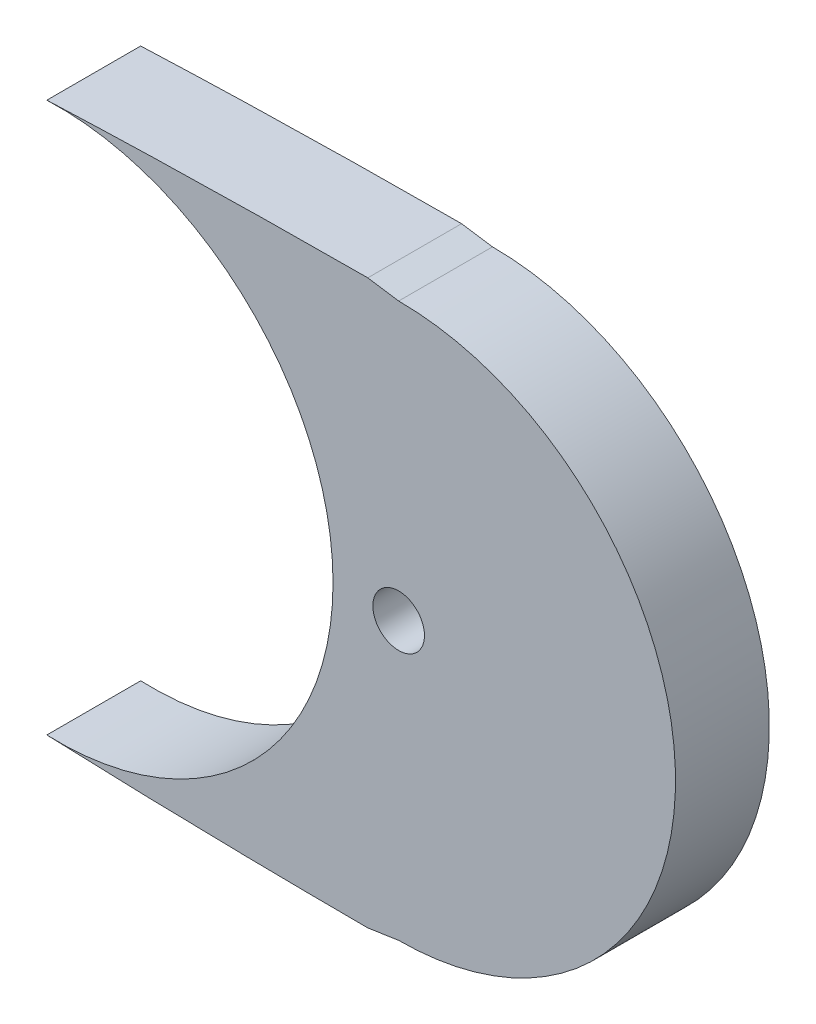
ISO-10303-21;
HEADER;
FILE_DESCRIPTION(('STEP AP214'),'2;1');
FILE_NAME('part.step','',(''),(''),'','','');
FILE_SCHEMA(('AUTOMOTIVE_DESIGN { 1 0 10303 214 1 1 1 1 }'));
ENDSEC;
DATA;
#1=APPLICATION_CONTEXT('core data for automotive mechanical design processes');
#2=APPLICATION_PROTOCOL_DEFINITION('international standard','automotive_design',2000,#1);
#3=PRODUCT_CONTEXT('',#1,'mechanical');
#4=PRODUCT('Part','Part','',(#3));
#5=PRODUCT_RELATED_PRODUCT_CATEGORY('part','',(#4));
#6=PRODUCT_DEFINITION_FORMATION('','',#4);
#7=PRODUCT_DEFINITION_CONTEXT('part definition',#1,'design');
#8=PRODUCT_DEFINITION('design','',#6,#7);
#9=PRODUCT_DEFINITION_SHAPE('','',#8);
#10=(LENGTH_UNIT() NAMED_UNIT(*) SI_UNIT(.MILLI.,.METRE.));
#11=(NAMED_UNIT(*) PLANE_ANGLE_UNIT() SI_UNIT($,.RADIAN.));
#12=(NAMED_UNIT(*) SI_UNIT($,.STERADIAN.) SOLID_ANGLE_UNIT());
#13=UNCERTAINTY_MEASURE_WITH_UNIT(LENGTH_MEASURE(1.E-05),#10,'distance_accuracy_value','');
#14=(GEOMETRIC_REPRESENTATION_CONTEXT(3) GLOBAL_UNCERTAINTY_ASSIGNED_CONTEXT((#13)) GLOBAL_UNIT_ASSIGNED_CONTEXT((#10,
#11,#12)) REPRESENTATION_CONTEXT('',''));
#15=CARTESIAN_POINT('',(0.,0.,0.));
#16=DIRECTION('',(0.,0.,1.));
#17=DIRECTION('',(1.,0.,0.));
#18=AXIS2_PLACEMENT_3D('',#15,#16,#17);
#19=CARTESIAN_POINT('',(300.,0.378,6.));
#20=CARTESIAN_POINT('',(299.845901447221,0.39961034336831,6.));
#21=CARTESIAN_POINT('',(299.230346714046,0.48593399083917,6.));
#22=CARTESIAN_POINT('',(297.848901683276,0.678531057447331,6.));
#23=CARTESIAN_POINT('',(295.556029122455,0.996787499241564,6.));
#24=CARTESIAN_POINT('',(292.365739581197,1.43343203295321,6.));
#25=CARTESIAN_POINT('',(288.297856433401,1.98344889126347,6.));
#26=CARTESIAN_POINT('',(283.377248038078,2.63572648359042,6.));
#27=CARTESIAN_POINT('',(277.63430498472,3.38149178862329,6.));
#28=CARTESIAN_POINT('',(271.104515413466,4.20901604095742,6.));
#29=CARTESIAN_POINT('',(263.828064626846,5.10718872872647,6.));
#30=CARTESIAN_POINT('',(255.849823781818,6.06276893212352,6.));
#31=CARTESIAN_POINT('',(247.21903434379,7.06424307195608,6.));
#32=CARTESIAN_POINT('',(237.988783489903,8.09787318806774,6.));
#33=CARTESIAN_POINT('',(228.216029511608,9.15107036010328,6.));
#34=CARTESIAN_POINT('',(217.961088379031,10.2107446574668,6.));
#35=CARTESIAN_POINT('',(207.287161839572,11.2632209265187,6.));
#36=CARTESIAN_POINT('',(196.260086850424,12.2937248064858,6.));
#37=CARTESIAN_POINT('',(184.947773044503,13.2887281219597,6.));
#38=CARTESIAN_POINT('',(173.420088229148,14.2315961384787,6.));
#39=CARTESIAN_POINT('',(161.747864995533,15.1069553720124,6.));
#40=CARTESIAN_POINT('',(150.00317252135,15.8985540753976,6.));
#41=CARTESIAN_POINT('',(138.258374542497,16.5898406039741,6.));
#42=CARTESIAN_POINT('',(126.585774705795,17.1633504747405,6.));
#43=CARTESIAN_POINT('',(115.057462615139,17.6037905135667,6.));
#44=CARTESIAN_POINT('',(103.744181572864,17.8967919128621,6.));
#45=CARTESIAN_POINT('',(92.7158453472272,18.0280433746414,6.));
#46=CARTESIAN_POINT('',(82.0402185013839,17.9871287273908,6.));
#47=CARTESIAN_POINT('',(71.7831190583338,17.7661449762132,6.));
#48=CARTESIAN_POINT('',(62.0076841473254,17.3594904245971,6.));
#49=CARTESIAN_POINT('',(52.7740834437817,16.7661013276277,6.));
#50=CARTESIAN_POINT('',(44.1390669938569,15.987763153894,6.));
#51=CARTESIAN_POINT('',(36.1554749512941,15.0305547578774,6.));
#52=CARTESIAN_POINT('',(28.8719698679608,13.9026205663682,6.));
#53=CARTESIAN_POINT('',(22.3326880228315,12.6157408879695,6.));
#54=CARTESIAN_POINT('',(16.5759570466198,11.1844668147641,6.));
#55=CARTESIAN_POINT('',(11.6344891822112,9.62275505380201,6.));
#56=CARTESIAN_POINT('',(7.53339032845527,7.94515078115887,6.));
#57=CARTESIAN_POINT('',(4.28573900369485,6.16300377839948,6.));
#58=CARTESIAN_POINT('',(1.8965325692393,4.27279663699588,6.));
#59=CARTESIAN_POINT('',(0.366265286449645,2.2288009510305,6.));
#60=CARTESIAN_POINT('',(-0.170692645797294,0.,6.));
#61=CARTESIAN_POINT('',(0.366265286449666,-2.22880095103055,6.));
#62=CARTESIAN_POINT('',(1.89653256923925,-4.27279663699582,6.));
#63=CARTESIAN_POINT('',(4.28573900369493,-6.16300377839955,6.));
#64=CARTESIAN_POINT('',(7.53339032845521,-7.94515078115883,6.));
#65=CARTESIAN_POINT('',(11.6344891822112,-9.62275505380201,6.));
#66=CARTESIAN_POINT('',(16.5759570466199,-11.1844668147641,6.));
#67=CARTESIAN_POINT('',(22.3326880228314,-12.6157408879695,6.));
#68=CARTESIAN_POINT('',(28.8719698679608,-13.9026205663682,6.));
#69=CARTESIAN_POINT('',(36.155474951294,-15.0305547578773,6.));
#70=CARTESIAN_POINT('',(44.1390669938569,-15.987763153894,6.));
#71=CARTESIAN_POINT('',(52.7740834437817,-16.7661013276277,6.));
#72=CARTESIAN_POINT('',(62.0076841473254,-17.3594904245971,6.));
#73=CARTESIAN_POINT('',(71.7831190583338,-17.7661449762132,6.));
#74=CARTESIAN_POINT('',(82.0402185013839,-17.9871287273908,6.));
#75=CARTESIAN_POINT('',(92.7158453472273,-18.0280433746414,6.));
#76=CARTESIAN_POINT('',(103.744181572864,-17.8967919128621,6.));
#77=CARTESIAN_POINT('',(115.057462615139,-17.6037905135667,6.));
#78=CARTESIAN_POINT('',(126.585774705795,-17.1633504747405,6.));
#79=CARTESIAN_POINT('',(138.258374542497,-16.5898406039741,6.));
#80=CARTESIAN_POINT('',(150.00317252135,-15.8985540753976,6.));
#81=CARTESIAN_POINT('',(161.747864995533,-15.1069553720124,6.));
#82=CARTESIAN_POINT('',(173.420088229148,-14.2315961384787,6.));
#83=CARTESIAN_POINT('',(184.947773044503,-13.2887281219597,6.));
#84=CARTESIAN_POINT('',(196.260086850424,-12.2937248064858,6.));
#85=CARTESIAN_POINT('',(207.287161839572,-11.2632209265187,6.));
#86=CARTESIAN_POINT('',(217.961088379031,-10.2107446574668,6.));
#87=CARTESIAN_POINT('',(228.216029511608,-9.15107036010328,6.));
#88=CARTESIAN_POINT('',(237.988783489903,-8.09787318806774,6.));
#89=CARTESIAN_POINT('',(247.21903434379,-7.06424307195608,6.));
#90=CARTESIAN_POINT('',(255.849823781818,-6.0627689321235,6.));
#91=CARTESIAN_POINT('',(263.828064626846,-5.10718872872648,6.));
#92=CARTESIAN_POINT('',(271.104515413466,-4.20901604095741,6.));
#93=CARTESIAN_POINT('',(277.63430498472,-3.38149178862329,6.));
#94=CARTESIAN_POINT('',(283.377248038078,-2.63572648359043,6.));
#95=CARTESIAN_POINT('',(288.297856433401,-1.98344889126346,6.));
#96=CARTESIAN_POINT('',(292.365739581198,-1.43343203295321,6.));
#97=CARTESIAN_POINT('',(295.556029122455,-0.996787499241567,6.));
#98=CARTESIAN_POINT('',(297.848901683276,-0.678531057447318,6.));
#99=CARTESIAN_POINT('',(299.230346714046,-0.48593399083919,6.));
#100=CARTESIAN_POINT('',(299.845901447221,-0.399610343368311,6.));
#101=CARTESIAN_POINT('',(300.,-0.378,6.));
#102=B_SPLINE_CURVE_WITH_KNOTS('',3,(#19,#20,#21,#22,#23,#24,#25,#26,#27,#28,#29,#30,#31,#32,
#33,#34,#35,#36,#37,#38,#39,#40,#41,#42,#43,#44,#45,#46,#47,#48,#49,#50,#51,#52,#53,#54,#55,#56,
#57,#58,#59,#60,#61,#62,#63,#64,#65,#66,#67,#68,#69,#70,#71,#72,#73,#74,#75,#76,#77,#78,#79,#80,
#81,#82,#83,#84,#85,#86,#87,#88,#89,#90,#91,#92,#93,#94,#95,#96,#97,#98,#99,#100,#101),
.UNSPECIFIED.,.F.,.F.,(4,1,1,1,1,1,1,1,1,1,1,1,1,1,1,1,1,1,1,1,1,1,1,1,1,1,1,1,1,1,1,1,1,1,1,1,
1,1,1,1,1,1,1,1,1,1,1,1,1,1,1,1,1,1,1,1,1,1,1,1,1,1,1,1,1,1,1,1,1,1,1,1,1,1,1,1,1,1,1,1,4),(0.,
0.000763156679271448,0.00304846929193477,0.00684068957953669,0.0121161317605396,
0.0188407924276644,0.0269727495182071,0.0364598537113803,0.0472429445210447,0.0592535547279477,
0.0724172643119224,0.0866510217067198,0.101866322474926,0.117968955401192,0.134857918638583,
0.152428309483259,0.170571841082248,0.189174521814913,0.208122338288737,0.227296649324545,
0.246580070424687,0.265853108019993,0.284996761496293,0.303895241632262,0.322432580929281,
0.340498658943124,0.357984483489282,0.37478811429809,0.390812303248415,0.405965006366899,
0.420162443159487,0.433328264782086,0.445393603392471,0.456301171479378,0.466003880875037,
0.474472000637231,0.481696232103684,0.487703697963338,0.492583405321472,0.496543603187854,0.5,
0.503456396812145,0.507416594678528,0.512296302036662,0.518303767896316,0.525527999362769,
0.533996119124963,0.543698828520622,0.554606396607529,0.566671735217914,0.579837556840513,
0.594034993633101,0.609187696751585,0.62521188570191,0.642015516510718,0.659501341056876,
0.677567419070719,0.696104758367738,0.715003238503707,0.734146891980006,0.753419929575313,
0.772703350675454,0.791877661711263,0.810825478185087,0.829428158917752,0.847571690516741,
0.865142081361417,0.882031044598807,0.898133677525074,0.91334897829328,0.927582735688077,
0.940746445272052,0.952757055478955,0.96354014628862,0.973027250481793,0.981159207572336,
0.98788386823946,0.993159310420463,0.996951530708065,0.999236843320729,1.),.UNSPECIFIED.);
#103=DIRECTION('',(0.,0.,-1.));
#104=VECTOR('',#103,1.);
#105=SURFACE_OF_LINEAR_EXTRUSION('',#102,#104);
#106=DIRECTION('',(0.,0.,1.));
#107=VECTOR('',#106,1.);
#108=CARTESIAN_POINT('',(88.0259213820013,18.002375730703,0.));
#109=LINE('',#108,#107);
#110=CARTESIAN_POINT('',(88.0259213820013,18.002375730703,0.));
#111=VERTEX_POINT('',#110);
#112=CARTESIAN_POINT('',(88.0259213820013,18.002375730703,6.));
#113=VERTEX_POINT('',#112);
#114=EDGE_CURVE('E82',#111,#113,#109,.T.);
#115=ORIENTED_EDGE('',*,*,#114,.F.);
#116=CARTESIAN_POINT('',(300.,0.378,0.));
#117=CARTESIAN_POINT('',(299.845901447221,0.39961034336831,0.));
#118=CARTESIAN_POINT('',(299.230346714046,0.48593399083917,0.));
#119=CARTESIAN_POINT('',(297.848901683276,0.678531057447331,0.));
#120=CARTESIAN_POINT('',(295.556029122455,0.996787499241564,0.));
#121=CARTESIAN_POINT('',(292.365739581197,1.43343203295321,0.));
#122=CARTESIAN_POINT('',(288.297856433401,1.98344889126347,0.));
#123=CARTESIAN_POINT('',(283.377248038078,2.63572648359042,0.));
#124=CARTESIAN_POINT('',(277.63430498472,3.38149178862329,0.));
#125=CARTESIAN_POINT('',(271.104515413466,4.20901604095742,0.));
#126=CARTESIAN_POINT('',(263.828064626846,5.10718872872647,0.));
#127=CARTESIAN_POINT('',(255.849823781818,6.06276893212352,0.));
#128=CARTESIAN_POINT('',(247.21903434379,7.06424307195608,0.));
#129=CARTESIAN_POINT('',(237.988783489903,8.09787318806774,0.));
#130=CARTESIAN_POINT('',(228.216029511608,9.15107036010328,0.));
#131=CARTESIAN_POINT('',(217.961088379031,10.2107446574668,0.));
#132=CARTESIAN_POINT('',(207.287161839572,11.2632209265187,0.));
#133=CARTESIAN_POINT('',(196.260086850424,12.2937248064858,0.));
#134=CARTESIAN_POINT('',(184.947773044503,13.2887281219597,0.));
#135=CARTESIAN_POINT('',(173.420088229148,14.2315961384787,0.));
#136=CARTESIAN_POINT('',(161.747864995533,15.1069553720124,0.));
#137=CARTESIAN_POINT('',(150.00317252135,15.8985540753976,0.));
#138=CARTESIAN_POINT('',(138.258374542497,16.5898406039741,0.));
#139=CARTESIAN_POINT('',(126.585774705795,17.1633504747405,0.));
#140=CARTESIAN_POINT('',(115.057462615139,17.6037905135667,0.));
#141=CARTESIAN_POINT('',(103.744181572864,17.8967919128621,0.));
#142=CARTESIAN_POINT('',(92.7158453472272,18.0280433746414,0.));
#143=CARTESIAN_POINT('',(82.0402185013839,17.9871287273908,0.));
#144=CARTESIAN_POINT('',(71.7831190583338,17.7661449762132,0.));
#145=CARTESIAN_POINT('',(62.0076841473254,17.3594904245971,0.));
#146=CARTESIAN_POINT('',(52.7740834437817,16.7661013276277,0.));
#147=CARTESIAN_POINT('',(44.1390669938569,15.987763153894,0.));
#148=CARTESIAN_POINT('',(36.1554749512941,15.0305547578774,0.));
#149=CARTESIAN_POINT('',(28.8719698679608,13.9026205663682,0.));
#150=CARTESIAN_POINT('',(22.3326880228315,12.6157408879695,0.));
#151=CARTESIAN_POINT('',(16.5759570466198,11.1844668147641,0.));
#152=CARTESIAN_POINT('',(11.6344891822112,9.62275505380201,0.));
#153=CARTESIAN_POINT('',(7.53339032845527,7.94515078115887,0.));
#154=CARTESIAN_POINT('',(4.28573900369485,6.16300377839948,0.));
#155=CARTESIAN_POINT('',(1.8965325692393,4.27279663699588,0.));
#156=CARTESIAN_POINT('',(0.366265286449645,2.2288009510305,0.));
#157=CARTESIAN_POINT('',(-0.170692645797294,0.,0.));
#158=CARTESIAN_POINT('',(0.366265286449666,-2.22880095103055,0.));
#159=CARTESIAN_POINT('',(1.89653256923925,-4.27279663699582,0.));
#160=CARTESIAN_POINT('',(4.28573900369493,-6.16300377839955,0.));
#161=CARTESIAN_POINT('',(7.53339032845521,-7.94515078115883,0.));
#162=CARTESIAN_POINT('',(11.6344891822112,-9.62275505380201,0.));
#163=CARTESIAN_POINT('',(16.5759570466199,-11.1844668147641,0.));
#164=CARTESIAN_POINT('',(22.3326880228314,-12.6157408879695,0.));
#165=CARTESIAN_POINT('',(28.8719698679608,-13.9026205663682,0.));
#166=CARTESIAN_POINT('',(36.155474951294,-15.0305547578773,0.));
#167=CARTESIAN_POINT('',(44.1390669938569,-15.987763153894,0.));
#168=CARTESIAN_POINT('',(52.7740834437817,-16.7661013276277,0.));
#169=CARTESIAN_POINT('',(62.0076841473254,-17.3594904245971,0.));
#170=CARTESIAN_POINT('',(71.7831190583338,-17.7661449762132,0.));
#171=CARTESIAN_POINT('',(82.0402185013839,-17.9871287273908,0.));
#172=CARTESIAN_POINT('',(92.7158453472273,-18.0280433746414,0.));
#173=CARTESIAN_POINT('',(103.744181572864,-17.8967919128621,0.));
#174=CARTESIAN_POINT('',(115.057462615139,-17.6037905135667,0.));
#175=CARTESIAN_POINT('',(126.585774705795,-17.1633504747405,0.));
#176=CARTESIAN_POINT('',(138.258374542497,-16.5898406039741,0.));
#177=CARTESIAN_POINT('',(150.00317252135,-15.8985540753976,0.));
#178=CARTESIAN_POINT('',(161.747864995533,-15.1069553720124,0.));
#179=CARTESIAN_POINT('',(173.420088229148,-14.2315961384787,0.));
#180=CARTESIAN_POINT('',(184.947773044503,-13.2887281219597,0.));
#181=CARTESIAN_POINT('',(196.260086850424,-12.2937248064858,0.));
#182=CARTESIAN_POINT('',(207.287161839572,-11.2632209265187,0.));
#183=CARTESIAN_POINT('',(217.961088379031,-10.2107446574668,0.));
#184=CARTESIAN_POINT('',(228.216029511608,-9.15107036010328,0.));
#185=CARTESIAN_POINT('',(237.988783489903,-8.09787318806774,0.));
#186=CARTESIAN_POINT('',(247.21903434379,-7.06424307195608,0.));
#187=CARTESIAN_POINT('',(255.849823781818,-6.0627689321235,0.));
#188=CARTESIAN_POINT('',(263.828064626846,-5.10718872872648,0.));
#189=CARTESIAN_POINT('',(271.104515413466,-4.20901604095741,0.));
#190=CARTESIAN_POINT('',(277.63430498472,-3.38149178862329,0.));
#191=CARTESIAN_POINT('',(283.377248038078,-2.63572648359043,0.));
#192=CARTESIAN_POINT('',(288.297856433401,-1.98344889126346,0.));
#193=CARTESIAN_POINT('',(292.365739581198,-1.43343203295321,0.));
#194=CARTESIAN_POINT('',(295.556029122455,-0.996787499241567,0.));
#195=CARTESIAN_POINT('',(297.848901683276,-0.678531057447318,0.));
#196=CARTESIAN_POINT('',(299.230346714046,-0.48593399083919,0.));
#197=CARTESIAN_POINT('',(299.845901447221,-0.399610343368311,0.));
#198=CARTESIAN_POINT('',(300.,-0.378,0.));
#199=B_SPLINE_CURVE_WITH_KNOTS('',3,(#116,#117,#118,#119,#120,#121,#122,#123,#124,#125,#126,
#127,#128,#129,#130,#131,#132,#133,#134,#135,#136,#137,#138,#139,#140,#141,#142,#143,#144,#145,
#146,#147,#148,#149,#150,#151,#152,#153,#154,#155,#156,#157,#158,#159,#160,#161,#162,#163,#164,
#165,#166,#167,#168,#169,#170,#171,#172,#173,#174,#175,#176,#177,#178,#179,#180,#181,#182,#183,
#184,#185,#186,#187,#188,#189,#190,#191,#192,#193,#194,#195,#196,#197,#198),.UNSPECIFIED.,.F.,
.F.,(4,1,1,1,1,1,1,1,1,1,1,1,1,1,1,1,1,1,1,1,1,1,1,1,1,1,1,1,1,1,1,1,1,1,1,1,1,1,1,1,1,1,1,1,1,
1,1,1,1,1,1,1,1,1,1,1,1,1,1,1,1,1,1,1,1,1,1,1,1,1,1,1,1,1,1,1,1,1,1,1,4),(0.,
0.000763156679271448,0.00304846929193477,0.00684068957953669,0.0121161317605396,
0.0188407924276644,0.0269727495182071,0.0364598537113803,0.0472429445210447,0.0592535547279477,
0.0724172643119224,0.0866510217067198,0.101866322474926,0.117968955401192,0.134857918638583,
0.152428309483259,0.170571841082248,0.189174521814913,0.208122338288737,0.227296649324545,
0.246580070424687,0.265853108019993,0.284996761496293,0.303895241632262,0.322432580929281,
0.340498658943124,0.357984483489282,0.37478811429809,0.390812303248415,0.405965006366899,
0.420162443159487,0.433328264782086,0.445393603392471,0.456301171479378,0.466003880875037,
0.474472000637231,0.481696232103684,0.487703697963338,0.492583405321472,0.496543603187854,0.5,
0.503456396812145,0.507416594678528,0.512296302036662,0.518303767896316,0.525527999362769,
0.533996119124963,0.543698828520622,0.554606396607529,0.566671735217914,0.579837556840513,
0.594034993633101,0.609187696751585,0.62521188570191,0.642015516510718,0.659501341056876,
0.677567419070719,0.696104758367738,0.715003238503707,0.734146891980006,0.753419929575313,
0.772703350675454,0.791877661711263,0.810825478185087,0.829428158917752,0.847571690516741,
0.865142081361417,0.882031044598807,0.898133677525074,0.91334897829328,0.927582735688077,
0.940746445272052,0.952757055478955,0.96354014628862,0.973027250481793,0.981159207572336,
0.98788386823946,0.993159310420463,0.996951530708065,0.999236843320729,1.),.UNSPECIFIED.);
#200=CARTESIAN_POINT('',(67.5,17.5789284761189,0.));
#201=VERTEX_POINT('',#200);
#202=EDGE_CURVE('E77',#111,#201,#199,.T.);
#203=ORIENTED_EDGE('',*,*,#202,.T.);
#204=DIRECTION('',(0.,0.,-1.));
#205=VECTOR('',#204,1.);
#206=CARTESIAN_POINT('',(67.5,17.5789284761189,6.));
#207=LINE('',#206,#205);
#208=CARTESIAN_POINT('',(67.5,17.5789284761189,6.));
#209=VERTEX_POINT('',#208);
#210=EDGE_CURVE('E47',#209,#201,#207,.T.);
#211=ORIENTED_EDGE('',*,*,#210,.F.);
#212=EDGE_CURVE('E63',#113,#209,#102,.T.);
#213=ORIENTED_EDGE('',*,*,#212,.F.);
#214=EDGE_LOOP('',(#115,#203,#211,#213));
#215=FACE_BOUND('',#214,.T.);
#216=ADVANCED_FACE('F39',(#215),#105,.F.);
#217=CARTESIAN_POINT('',(0.,0.,6.));
#218=DIRECTION('',(0.,0.,1.));
#219=DIRECTION('',(1.,0.,0.));
#220=AXIS2_PLACEMENT_3D('',#217,#218,#219);
#221=PLANE('',#220);
#222=CARTESIAN_POINT('',(89.9999999999997,0.,6.));
#223=DIRECTION('',(0.,0.,1.));
#224=DIRECTION('',(1.,0.,0.));
#225=AXIS2_PLACEMENT_3D('',#222,#223,#224);
#226=CIRCLE('',#225,1.65);
#227=CARTESIAN_POINT('',(91.6499999999997,0.,6.));
#228=VERTEX_POINT('',#227);
#229=EDGE_CURVE('E94',#228,#228,#226,.T.);
#230=ORIENTED_EDGE('',*,*,#229,.F.);
#231=EDGE_LOOP('',(#230));
#232=FACE_BOUND('',#231,.T.);
#233=CARTESIAN_POINT('',(89.9999999999997,0.,6.));
#234=DIRECTION('',(0.,0.,1.));
#235=DIRECTION('',(1.,0.,0.));
#236=AXIS2_PLACEMENT_3D('',#233,#234,#235);
#237=CIRCLE('',#236,17.7051977534897);
#238=CARTESIAN_POINT('',(89.9999999999996,-17.7051977534897,6.));
#239=VERTEX_POINT('',#238);
#240=CARTESIAN_POINT('',(89.9999999999998,17.7051977534897,6.));
#241=VERTEX_POINT('',#240);
#242=EDGE_CURVE('E177',#239,#241,#237,.T.);
#243=ORIENTED_EDGE('',*,*,#242,.T.);
#244=DIRECTION('',(-0.988857866602842,0.148862754433993,0.));
#245=VECTOR('',#244,1.);
#246=CARTESIAN_POINT('',(4.60068857190731,30.5612179716694,6.));
#247=LINE('',#246,#245);
#248=EDGE_CURVE('E165',#241,#113,#247,.T.);
#249=ORIENTED_EDGE('',*,*,#248,.T.);
#250=ORIENTED_EDGE('',*,*,#212,.T.);
#251=CARTESIAN_POINT('',(68.2098517870718,0.,6.));
#252=DIRECTION('',(0.,0.,1.));
#253=DIRECTION('',(1.,0.,0.));
#254=AXIS2_PLACEMENT_3D('',#251,#252,#253);
#255=CIRCLE('',#254,17.5932548417885);
#256=CARTESIAN_POINT('',(67.5,-17.5789284761189,6.));
#257=VERTEX_POINT('',#256);
#258=EDGE_CURVE('E93',#209,#257,#255,.F.);
#259=ORIENTED_EDGE('',*,*,#258,.T.);
#260=CARTESIAN_POINT('',(300.,0.378,6.));
#261=CARTESIAN_POINT('',(299.845901447221,0.39961034336831,6.));
#262=CARTESIAN_POINT('',(299.230346714046,0.48593399083917,6.));
#263=CARTESIAN_POINT('',(297.848901683276,0.678531057447331,6.));
#264=CARTESIAN_POINT('',(295.556029122455,0.996787499241564,6.));
#265=CARTESIAN_POINT('',(292.365739581197,1.43343203295321,6.));
#266=CARTESIAN_POINT('',(288.297856433401,1.98344889126347,6.));
#267=CARTESIAN_POINT('',(283.377248038078,2.63572648359042,6.));
#268=CARTESIAN_POINT('',(277.63430498472,3.38149178862329,6.));
#269=CARTESIAN_POINT('',(271.104515413466,4.20901604095742,6.));
#270=CARTESIAN_POINT('',(263.828064626846,5.10718872872647,6.));
#271=CARTESIAN_POINT('',(255.849823781818,6.06276893212352,6.));
#272=CARTESIAN_POINT('',(247.21903434379,7.06424307195608,6.));
#273=CARTESIAN_POINT('',(237.988783489903,8.09787318806774,6.));
#274=CARTESIAN_POINT('',(228.216029511608,9.15107036010328,6.));
#275=CARTESIAN_POINT('',(217.961088379031,10.2107446574668,6.));
#276=CARTESIAN_POINT('',(207.287161839572,11.2632209265187,6.));
#277=CARTESIAN_POINT('',(196.260086850424,12.2937248064858,6.));
#278=CARTESIAN_POINT('',(184.947773044503,13.2887281219597,6.));
#279=CARTESIAN_POINT('',(173.420088229148,14.2315961384787,6.));
#280=CARTESIAN_POINT('',(161.747864995533,15.1069553720124,6.));
#281=CARTESIAN_POINT('',(150.00317252135,15.8985540753976,6.));
#282=CARTESIAN_POINT('',(138.258374542497,16.5898406039741,6.));
#283=CARTESIAN_POINT('',(126.585774705795,17.1633504747405,6.));
#284=CARTESIAN_POINT('',(115.057462615139,17.6037905135667,6.));
#285=CARTESIAN_POINT('',(103.744181572864,17.8967919128621,6.));
#286=CARTESIAN_POINT('',(92.7158453472272,18.0280433746414,6.));
#287=CARTESIAN_POINT('',(82.0402185013839,17.9871287273908,6.));
#288=CARTESIAN_POINT('',(71.7831190583338,17.7661449762132,6.));
#289=CARTESIAN_POINT('',(62.0076841473254,17.3594904245971,6.));
#290=CARTESIAN_POINT('',(52.7740834437817,16.7661013276277,6.));
#291=CARTESIAN_POINT('',(44.1390669938569,15.987763153894,6.));
#292=CARTESIAN_POINT('',(36.1554749512941,15.0305547578774,6.));
#293=CARTESIAN_POINT('',(28.8719698679608,13.9026205663682,6.));
#294=CARTESIAN_POINT('',(22.3326880228315,12.6157408879695,6.));
#295=CARTESIAN_POINT('',(16.5759570466198,11.1844668147641,6.));
#296=CARTESIAN_POINT('',(11.6344891822112,9.62275505380201,6.));
#297=CARTESIAN_POINT('',(7.53339032845527,7.94515078115887,6.));
#298=CARTESIAN_POINT('',(4.28573900369485,6.16300377839948,6.));
#299=CARTESIAN_POINT('',(1.8965325692393,4.27279663699588,6.));
#300=CARTESIAN_POINT('',(0.366265286449645,2.2288009510305,6.));
#301=CARTESIAN_POINT('',(-0.170692645797294,0.,6.));
#302=CARTESIAN_POINT('',(0.366265286449666,-2.22880095103055,6.));
#303=CARTESIAN_POINT('',(1.89653256923925,-4.27279663699582,6.));
#304=CARTESIAN_POINT('',(4.28573900369493,-6.16300377839955,6.));
#305=CARTESIAN_POINT('',(7.53339032845521,-7.94515078115883,6.));
#306=CARTESIAN_POINT('',(11.6344891822112,-9.62275505380201,6.));
#307=CARTESIAN_POINT('',(16.5759570466199,-11.1844668147641,6.));
#308=CARTESIAN_POINT('',(22.3326880228314,-12.6157408879695,6.));
#309=CARTESIAN_POINT('',(28.8719698679608,-13.9026205663682,6.));
#310=CARTESIAN_POINT('',(36.155474951294,-15.0305547578773,6.));
#311=CARTESIAN_POINT('',(44.1390669938569,-15.987763153894,6.));
#312=CARTESIAN_POINT('',(52.7740834437817,-16.7661013276277,6.));
#313=CARTESIAN_POINT('',(62.0076841473254,-17.3594904245971,6.));
#314=CARTESIAN_POINT('',(71.7831190583338,-17.7661449762132,6.));
#315=CARTESIAN_POINT('',(82.0402185013839,-17.9871287273908,6.));
#316=CARTESIAN_POINT('',(92.7158453472273,-18.0280433746414,6.));
#317=CARTESIAN_POINT('',(103.744181572864,-17.8967919128621,6.));
#318=CARTESIAN_POINT('',(115.057462615139,-17.6037905135667,6.));
#319=CARTESIAN_POINT('',(126.585774705795,-17.1633504747405,6.));
#320=CARTESIAN_POINT('',(138.258374542497,-16.5898406039741,6.));
#321=CARTESIAN_POINT('',(150.00317252135,-15.8985540753976,6.));
#322=CARTESIAN_POINT('',(161.747864995533,-15.1069553720124,6.));
#323=CARTESIAN_POINT('',(173.420088229148,-14.2315961384787,6.));
#324=CARTESIAN_POINT('',(184.947773044503,-13.2887281219597,6.));
#325=CARTESIAN_POINT('',(196.260086850424,-12.2937248064858,6.));
#326=CARTESIAN_POINT('',(207.287161839572,-11.2632209265187,6.));
#327=CARTESIAN_POINT('',(217.961088379031,-10.2107446574668,6.));
#328=CARTESIAN_POINT('',(228.216029511608,-9.15107036010328,6.));
#329=CARTESIAN_POINT('',(237.988783489903,-8.09787318806774,6.));
#330=CARTESIAN_POINT('',(247.21903434379,-7.06424307195608,6.));
#331=CARTESIAN_POINT('',(255.849823781818,-6.0627689321235,6.));
#332=CARTESIAN_POINT('',(263.828064626846,-5.10718872872648,6.));
#333=CARTESIAN_POINT('',(271.104515413466,-4.20901604095741,6.));
#334=CARTESIAN_POINT('',(277.63430498472,-3.38149178862329,6.));
#335=CARTESIAN_POINT('',(283.377248038078,-2.63572648359043,6.));
#336=CARTESIAN_POINT('',(288.297856433401,-1.98344889126346,6.));
#337=CARTESIAN_POINT('',(292.365739581198,-1.43343203295321,6.));
#338=CARTESIAN_POINT('',(295.556029122455,-0.996787499241567,6.));
#339=CARTESIAN_POINT('',(297.848901683276,-0.678531057447318,6.));
#340=CARTESIAN_POINT('',(299.230346714046,-0.48593399083919,6.));
#341=CARTESIAN_POINT('',(299.845901447221,-0.399610343368311,6.));
#342=CARTESIAN_POINT('',(300.,-0.378,6.));
#343=B_SPLINE_CURVE_WITH_KNOTS('',3,(#260,#261,#262,#263,#264,#265,#266,#267,#268,#269,#270,
#271,#272,#273,#274,#275,#276,#277,#278,#279,#280,#281,#282,#283,#284,#285,#286,#287,#288,#289,
#290,#291,#292,#293,#294,#295,#296,#297,#298,#299,#300,#301,#302,#303,#304,#305,#306,#307,#308,
#309,#310,#311,#312,#313,#314,#315,#316,#317,#318,#319,#320,#321,#322,#323,#324,#325,#326,#327,
#328,#329,#330,#331,#332,#333,#334,#335,#336,#337,#338,#339,#340,#341,#342),.UNSPECIFIED.,.F.,
.F.,(4,1,1,1,1,1,1,1,1,1,1,1,1,1,1,1,1,1,1,1,1,1,1,1,1,1,1,1,1,1,1,1,1,1,1,1,1,1,1,1,1,1,1,1,1,
1,1,1,1,1,1,1,1,1,1,1,1,1,1,1,1,1,1,1,1,1,1,1,1,1,1,1,1,1,1,1,1,1,1,1,4),(0.,
0.000763156679271448,0.00304846929193477,0.00684068957953669,0.0121161317605396,
0.0188407924276644,0.0269727495182071,0.0364598537113803,0.0472429445210447,0.0592535547279477,
0.0724172643119224,0.0866510217067198,0.101866322474926,0.117968955401192,0.134857918638583,
0.152428309483259,0.170571841082248,0.189174521814913,0.208122338288737,0.227296649324545,
0.246580070424687,0.265853108019993,0.284996761496293,0.303895241632262,0.322432580929281,
0.340498658943124,0.357984483489282,0.37478811429809,0.390812303248415,0.405965006366899,
0.420162443159487,0.433328264782086,0.445393603392471,0.456301171479378,0.466003880875037,
0.474472000637231,0.481696232103684,0.487703697963338,0.492583405321472,0.496543603187854,0.5,
0.503456396812145,0.507416594678528,0.512296302036662,0.518303767896316,0.525527999362769,
0.533996119124963,0.543698828520622,0.554606396607529,0.566671735217914,0.579837556840513,
0.594034993633101,0.609187696751585,0.62521188570191,0.642015516510718,0.659501341056876,
0.677567419070719,0.696104758367738,0.715003238503707,0.734146891980006,0.753419929575313,
0.772703350675454,0.791877661711263,0.810825478185087,0.829428158917752,0.847571690516741,
0.865142081361417,0.882031044598807,0.898133677525074,0.91334897829328,0.927582735688077,
0.940746445272052,0.952757055478955,0.96354014628862,0.973027250481793,0.981159207572336,
0.98788386823946,0.993159310420463,0.996951530708065,0.999236843320729,1.),.UNSPECIFIED.);
#344=CARTESIAN_POINT('',(88.0259213820013,-18.002375730703,6.));
#345=VERTEX_POINT('',#344);
#346=EDGE_CURVE('E118',#257,#345,#343,.T.);
#347=ORIENTED_EDGE('',*,*,#346,.T.);
#348=DIRECTION('',(-0.98885786660284,-0.148862754434008,0.));
#349=VECTOR('',#348,1.);
#350=CARTESIAN_POINT('',(4.60068857190799,-30.5612179716706,6.));
#351=LINE('',#350,#349);
#352=EDGE_CURVE('E171',#239,#345,#351,.T.);
#353=ORIENTED_EDGE('',*,*,#352,.F.);
#354=EDGE_LOOP('',(#243,#249,#250,#259,#347,#353));
#355=FACE_BOUND('',#354,.T.);
#356=ADVANCED_FACE('F141',(#232,#355),#221,.T.);
#357=CARTESIAN_POINT('',(0.,0.,0.));
#358=DIRECTION('',(0.,0.,1.));
#359=DIRECTION('',(1.,0.,0.));
#360=AXIS2_PLACEMENT_3D('',#357,#358,#359);
#361=PLANE('',#360);
#362=CARTESIAN_POINT('',(89.9999999999997,0.,0.));
#363=DIRECTION('',(0.,0.,1.));
#364=DIRECTION('',(1.,0.,0.));
#365=AXIS2_PLACEMENT_3D('',#362,#363,#364);
#366=CIRCLE('',#365,1.65);
#367=CARTESIAN_POINT('',(91.6499999999997,0.,0.));
#368=VERTEX_POINT('',#367);
#369=EDGE_CURVE('E86',#368,#368,#366,.T.);
#370=ORIENTED_EDGE('',*,*,#369,.T.);
#371=EDGE_LOOP('',(#370));
#372=FACE_BOUND('',#371,.T.);
#373=DIRECTION('',(-0.988857866602842,0.148862754433993,0.));
#374=VECTOR('',#373,1.);
#375=CARTESIAN_POINT('',(4.60068857190731,30.5612179716694,0.));
#376=LINE('',#375,#374);
#377=CARTESIAN_POINT('',(89.9999999999998,17.7051977534897,0.));
#378=VERTEX_POINT('',#377);
#379=EDGE_CURVE('E183',#378,#111,#376,.T.);
#380=ORIENTED_EDGE('',*,*,#379,.F.);
#381=CARTESIAN_POINT('',(89.9999999999997,0.,0.));
#382=DIRECTION('',(0.,0.,1.));
#383=DIRECTION('',(1.,0.,0.));
#384=AXIS2_PLACEMENT_3D('',#381,#382,#383);
#385=CIRCLE('',#384,17.7051977534897);
#386=CARTESIAN_POINT('',(89.9999999999996,-17.7051977534897,0.));
#387=VERTEX_POINT('',#386);
#388=EDGE_CURVE('E170',#387,#378,#385,.T.);
#389=ORIENTED_EDGE('',*,*,#388,.F.);
#390=DIRECTION('',(-0.98885786660284,-0.148862754434008,0.));
#391=VECTOR('',#390,1.);
#392=CARTESIAN_POINT('',(4.60068857190799,-30.5612179716706,0.));
#393=LINE('',#392,#391);
#394=CARTESIAN_POINT('',(88.0259213820013,-18.002375730703,0.));
#395=VERTEX_POINT('',#394);
#396=EDGE_CURVE('E188',#387,#395,#393,.T.);
#397=ORIENTED_EDGE('',*,*,#396,.T.);
#398=CARTESIAN_POINT('',(300.,0.378,0.));
#399=CARTESIAN_POINT('',(299.845901447221,0.39961034336831,0.));
#400=CARTESIAN_POINT('',(299.230346714046,0.48593399083917,0.));
#401=CARTESIAN_POINT('',(297.848901683276,0.678531057447331,0.));
#402=CARTESIAN_POINT('',(295.556029122455,0.996787499241564,0.));
#403=CARTESIAN_POINT('',(292.365739581197,1.43343203295321,0.));
#404=CARTESIAN_POINT('',(288.297856433401,1.98344889126347,0.));
#405=CARTESIAN_POINT('',(283.377248038078,2.63572648359042,0.));
#406=CARTESIAN_POINT('',(277.63430498472,3.38149178862329,0.));
#407=CARTESIAN_POINT('',(271.104515413466,4.20901604095742,0.));
#408=CARTESIAN_POINT('',(263.828064626846,5.10718872872647,0.));
#409=CARTESIAN_POINT('',(255.849823781818,6.06276893212352,0.));
#410=CARTESIAN_POINT('',(247.21903434379,7.06424307195608,0.));
#411=CARTESIAN_POINT('',(237.988783489903,8.09787318806774,0.));
#412=CARTESIAN_POINT('',(228.216029511608,9.15107036010328,0.));
#413=CARTESIAN_POINT('',(217.961088379031,10.2107446574668,0.));
#414=CARTESIAN_POINT('',(207.287161839572,11.2632209265187,0.));
#415=CARTESIAN_POINT('',(196.260086850424,12.2937248064858,0.));
#416=CARTESIAN_POINT('',(184.947773044503,13.2887281219597,0.));
#417=CARTESIAN_POINT('',(173.420088229148,14.2315961384787,0.));
#418=CARTESIAN_POINT('',(161.747864995533,15.1069553720124,0.));
#419=CARTESIAN_POINT('',(150.00317252135,15.8985540753976,0.));
#420=CARTESIAN_POINT('',(138.258374542497,16.5898406039741,0.));
#421=CARTESIAN_POINT('',(126.585774705795,17.1633504747405,0.));
#422=CARTESIAN_POINT('',(115.057462615139,17.6037905135667,0.));
#423=CARTESIAN_POINT('',(103.744181572864,17.8967919128621,0.));
#424=CARTESIAN_POINT('',(92.7158453472272,18.0280433746414,0.));
#425=CARTESIAN_POINT('',(82.0402185013839,17.9871287273908,0.));
#426=CARTESIAN_POINT('',(71.7831190583338,17.7661449762132,0.));
#427=CARTESIAN_POINT('',(62.0076841473254,17.3594904245971,0.));
#428=CARTESIAN_POINT('',(52.7740834437817,16.7661013276277,0.));
#429=CARTESIAN_POINT('',(44.1390669938569,15.987763153894,0.));
#430=CARTESIAN_POINT('',(36.1554749512941,15.0305547578774,0.));
#431=CARTESIAN_POINT('',(28.8719698679608,13.9026205663682,0.));
#432=CARTESIAN_POINT('',(22.3326880228315,12.6157408879695,0.));
#433=CARTESIAN_POINT('',(16.5759570466198,11.1844668147641,0.));
#434=CARTESIAN_POINT('',(11.6344891822112,9.62275505380201,0.));
#435=CARTESIAN_POINT('',(7.53339032845527,7.94515078115887,0.));
#436=CARTESIAN_POINT('',(4.28573900369485,6.16300377839948,0.));
#437=CARTESIAN_POINT('',(1.8965325692393,4.27279663699588,0.));
#438=CARTESIAN_POINT('',(0.366265286449645,2.2288009510305,0.));
#439=CARTESIAN_POINT('',(-0.170692645797294,0.,0.));
#440=CARTESIAN_POINT('',(0.366265286449666,-2.22880095103055,0.));
#441=CARTESIAN_POINT('',(1.89653256923925,-4.27279663699582,0.));
#442=CARTESIAN_POINT('',(4.28573900369493,-6.16300377839955,0.));
#443=CARTESIAN_POINT('',(7.53339032845521,-7.94515078115883,0.));
#444=CARTESIAN_POINT('',(11.6344891822112,-9.62275505380201,0.));
#445=CARTESIAN_POINT('',(16.5759570466199,-11.1844668147641,0.));
#446=CARTESIAN_POINT('',(22.3326880228314,-12.6157408879695,0.));
#447=CARTESIAN_POINT('',(28.8719698679608,-13.9026205663682,0.));
#448=CARTESIAN_POINT('',(36.155474951294,-15.0305547578773,0.));
#449=CARTESIAN_POINT('',(44.1390669938569,-15.987763153894,0.));
#450=CARTESIAN_POINT('',(52.7740834437817,-16.7661013276277,0.));
#451=CARTESIAN_POINT('',(62.0076841473254,-17.3594904245971,0.));
#452=CARTESIAN_POINT('',(71.7831190583338,-17.7661449762132,0.));
#453=CARTESIAN_POINT('',(82.0402185013839,-17.9871287273908,0.));
#454=CARTESIAN_POINT('',(92.7158453472273,-18.0280433746414,0.));
#455=CARTESIAN_POINT('',(103.744181572864,-17.8967919128621,0.));
#456=CARTESIAN_POINT('',(115.057462615139,-17.6037905135667,0.));
#457=CARTESIAN_POINT('',(126.585774705795,-17.1633504747405,0.));
#458=CARTESIAN_POINT('',(138.258374542497,-16.5898406039741,0.));
#459=CARTESIAN_POINT('',(150.00317252135,-15.8985540753976,0.));
#460=CARTESIAN_POINT('',(161.747864995533,-15.1069553720124,0.));
#461=CARTESIAN_POINT('',(173.420088229148,-14.2315961384787,0.));
#462=CARTESIAN_POINT('',(184.947773044503,-13.2887281219597,0.));
#463=CARTESIAN_POINT('',(196.260086850424,-12.2937248064858,0.));
#464=CARTESIAN_POINT('',(207.287161839572,-11.2632209265187,0.));
#465=CARTESIAN_POINT('',(217.961088379031,-10.2107446574668,0.));
#466=CARTESIAN_POINT('',(228.216029511608,-9.15107036010328,0.));
#467=CARTESIAN_POINT('',(237.988783489903,-8.09787318806774,0.));
#468=CARTESIAN_POINT('',(247.21903434379,-7.06424307195608,0.));
#469=CARTESIAN_POINT('',(255.849823781818,-6.0627689321235,0.));
#470=CARTESIAN_POINT('',(263.828064626846,-5.10718872872648,0.));
#471=CARTESIAN_POINT('',(271.104515413466,-4.20901604095741,0.));
#472=CARTESIAN_POINT('',(277.63430498472,-3.38149178862329,0.));
#473=CARTESIAN_POINT('',(283.377248038078,-2.63572648359043,0.));
#474=CARTESIAN_POINT('',(288.297856433401,-1.98344889126346,0.));
#475=CARTESIAN_POINT('',(292.365739581198,-1.43343203295321,0.));
#476=CARTESIAN_POINT('',(295.556029122455,-0.996787499241567,0.));
#477=CARTESIAN_POINT('',(297.848901683276,-0.678531057447318,0.));
#478=CARTESIAN_POINT('',(299.230346714046,-0.48593399083919,0.));
#479=CARTESIAN_POINT('',(299.845901447221,-0.399610343368311,0.));
#480=CARTESIAN_POINT('',(300.,-0.378,0.));
#481=B_SPLINE_CURVE_WITH_KNOTS('',3,(#398,#399,#400,#401,#402,#403,#404,#405,#406,#407,#408,
#409,#410,#411,#412,#413,#414,#415,#416,#417,#418,#419,#420,#421,#422,#423,#424,#425,#426,#427,
#428,#429,#430,#431,#432,#433,#434,#435,#436,#437,#438,#439,#440,#441,#442,#443,#444,#445,#446,
#447,#448,#449,#450,#451,#452,#453,#454,#455,#456,#457,#458,#459,#460,#461,#462,#463,#464,#465,
#466,#467,#468,#469,#470,#471,#472,#473,#474,#475,#476,#477,#478,#479,#480),.UNSPECIFIED.,.F.,
.F.,(4,1,1,1,1,1,1,1,1,1,1,1,1,1,1,1,1,1,1,1,1,1,1,1,1,1,1,1,1,1,1,1,1,1,1,1,1,1,1,1,1,1,1,1,1,
1,1,1,1,1,1,1,1,1,1,1,1,1,1,1,1,1,1,1,1,1,1,1,1,1,1,1,1,1,1,1,1,1,1,1,4),(0.,
0.000763156679271448,0.00304846929193477,0.00684068957953669,0.0121161317605396,
0.0188407924276644,0.0269727495182071,0.0364598537113803,0.0472429445210447,0.0592535547279477,
0.0724172643119224,0.0866510217067198,0.101866322474926,0.117968955401192,0.134857918638583,
0.152428309483259,0.170571841082248,0.189174521814913,0.208122338288737,0.227296649324545,
0.246580070424687,0.265853108019993,0.284996761496293,0.303895241632262,0.322432580929281,
0.340498658943124,0.357984483489282,0.37478811429809,0.390812303248415,0.405965006366899,
0.420162443159487,0.433328264782086,0.445393603392471,0.456301171479378,0.466003880875037,
0.474472000637231,0.481696232103684,0.487703697963338,0.492583405321472,0.496543603187854,0.5,
0.503456396812145,0.507416594678528,0.512296302036662,0.518303767896316,0.525527999362769,
0.533996119124963,0.543698828520622,0.554606396607529,0.566671735217914,0.579837556840513,
0.594034993633101,0.609187696751585,0.62521188570191,0.642015516510718,0.659501341056876,
0.677567419070719,0.696104758367738,0.715003238503707,0.734146891980006,0.753419929575313,
0.772703350675454,0.791877661711263,0.810825478185087,0.829428158917752,0.847571690516741,
0.865142081361417,0.882031044598807,0.898133677525074,0.91334897829328,0.927582735688077,
0.940746445272052,0.952757055478955,0.96354014628862,0.973027250481793,0.981159207572336,
0.98788386823946,0.993159310420463,0.996951530708065,0.999236843320729,1.),.UNSPECIFIED.);
#482=CARTESIAN_POINT('',(67.5,-17.5789284761189,0.));
#483=VERTEX_POINT('',#482);
#484=EDGE_CURVE('E87',#483,#395,#481,.T.);
#485=ORIENTED_EDGE('',*,*,#484,.F.);
#486=CARTESIAN_POINT('',(68.2098517870718,0.,0.));
#487=DIRECTION('',(0.,0.,1.));
#488=DIRECTION('',(1.,0.,0.));
#489=AXIS2_PLACEMENT_3D('',#486,#487,#488);
#490=CIRCLE('',#489,17.5932548417885);
#491=EDGE_CURVE('E92',#201,#483,#490,.F.);
#492=ORIENTED_EDGE('',*,*,#491,.F.);
#493=ORIENTED_EDGE('',*,*,#202,.F.);
#494=EDGE_LOOP('',(#380,#389,#397,#485,#492,#493));
#495=FACE_BOUND('',#494,.T.);
#496=ADVANCED_FACE('F95',(#372,#495),#361,.F.);
#497=CARTESIAN_POINT('',(68.2098517870718,0.,6.));
#498=DIRECTION('',(0.,0.,-1.));
#499=DIRECTION('',(-1.,0.,0.));
#500=AXIS2_PLACEMENT_3D('',#497,#498,#499);
#501=CYLINDRICAL_SURFACE('',#500,17.5932548417885);
#502=ORIENTED_EDGE('',*,*,#491,.T.);
#503=DIRECTION('',(0.,0.,-1.));
#504=VECTOR('',#503,1.);
#505=CARTESIAN_POINT('',(67.5,-17.5789284761189,6.));
#506=LINE('',#505,#504);
#507=EDGE_CURVE('E11',#257,#483,#506,.T.);
#508=ORIENTED_EDGE('',*,*,#507,.F.);
#509=ORIENTED_EDGE('',*,*,#258,.F.);
#510=ORIENTED_EDGE('',*,*,#210,.T.);
#511=EDGE_LOOP('',(#502,#508,#509,#510));
#512=FACE_BOUND('',#511,.T.);
#513=ADVANCED_FACE('F41',(#512),#501,.F.);
#514=DIRECTION('',(0.,0.,-1.));
#515=VECTOR('',#514,1.);
#516=SURFACE_OF_LINEAR_EXTRUSION('',#343,#515);
#517=ORIENTED_EDGE('',*,*,#484,.T.);
#518=DIRECTION('',(0.,0.,1.));
#519=VECTOR('',#518,1.);
#520=CARTESIAN_POINT('',(88.0259213820013,-18.002375730703,0.));
#521=LINE('',#520,#519);
#522=EDGE_CURVE('E54',#395,#345,#521,.T.);
#523=ORIENTED_EDGE('',*,*,#522,.T.);
#524=ORIENTED_EDGE('',*,*,#346,.F.);
#525=ORIENTED_EDGE('',*,*,#507,.T.);
#526=EDGE_LOOP('',(#517,#523,#524,#525));
#527=FACE_BOUND('',#526,.T.);
#528=ADVANCED_FACE('F134',(#527),#516,.F.);
#529=CARTESIAN_POINT('',(89.9999999999997,0.,6.));
#530=DIRECTION('',(0.,0.,-1.));
#531=DIRECTION('',(-1.,0.,0.));
#532=AXIS2_PLACEMENT_3D('',#529,#530,#531);
#533=CYLINDRICAL_SURFACE('',#532,1.65);
#534=ORIENTED_EDGE('',*,*,#229,.T.);
#535=EDGE_LOOP('',(#534));
#536=FACE_BOUND('',#535,.T.);
#537=ORIENTED_EDGE('',*,*,#369,.F.);
#538=EDGE_LOOP('',(#537));
#539=FACE_BOUND('',#538,.T.);
#540=ADVANCED_FACE('F137',(#536,#539),#533,.F.);
#541=CARTESIAN_POINT('',(89.9999999999997,0.,0.));
#542=DIRECTION('',(0.,0.,1.));
#543=DIRECTION('',(1.,0.,0.));
#544=AXIS2_PLACEMENT_3D('',#541,#542,#543);
#545=CYLINDRICAL_SURFACE('',#544,17.7051977534897);
#546=ORIENTED_EDGE('',*,*,#242,.F.);
#547=DIRECTION('',(0.,0.,1.));
#548=VECTOR('',#547,1.);
#549=CARTESIAN_POINT('',(89.9999999999996,-17.7051977534897,0.));
#550=LINE('',#549,#548);
#551=EDGE_CURVE('E123',#387,#239,#550,.T.);
#552=ORIENTED_EDGE('',*,*,#551,.F.);
#553=ORIENTED_EDGE('',*,*,#388,.T.);
#554=DIRECTION('',(0.,0.,1.));
#555=VECTOR('',#554,1.);
#556=CARTESIAN_POINT('',(89.9999999999998,17.7051977534897,0.));
#557=LINE('',#556,#555);
#558=EDGE_CURVE('E97',#378,#241,#557,.T.);
#559=ORIENTED_EDGE('',*,*,#558,.T.);
#560=EDGE_LOOP('',(#546,#552,#553,#559));
#561=FACE_BOUND('',#560,.T.);
#562=ADVANCED_FACE('F144',(#561),#545,.T.);
#563=CARTESIAN_POINT('',(4.60068857190731,30.5612179716694,0.));
#564=DIRECTION('',(0.148862754433993,0.988857866602842,0.));
#565=DIRECTION('',(-0.988857866602842,0.148862754433993,0.));
#566=AXIS2_PLACEMENT_3D('',#563,#564,#565);
#567=PLANE('',#566);
#568=ORIENTED_EDGE('',*,*,#248,.F.);
#569=ORIENTED_EDGE('',*,*,#558,.F.);
#570=ORIENTED_EDGE('',*,*,#379,.T.);
#571=ORIENTED_EDGE('',*,*,#114,.T.);
#572=EDGE_LOOP('',(#568,#569,#570,#571));
#573=FACE_BOUND('',#572,.T.);
#574=ADVANCED_FACE('F153',(#573),#567,.T.);
#575=CARTESIAN_POINT('',(4.60068857190799,-30.5612179716706,0.));
#576=DIRECTION('',(-0.148862754434008,0.98885786660284,0.));
#577=DIRECTION('',(-0.98885786660284,-0.148862754434008,0.));
#578=AXIS2_PLACEMENT_3D('',#575,#576,#577);
#579=PLANE('',#578);
#580=ORIENTED_EDGE('',*,*,#352,.T.);
#581=ORIENTED_EDGE('',*,*,#522,.F.);
#582=ORIENTED_EDGE('',*,*,#396,.F.);
#583=ORIENTED_EDGE('',*,*,#551,.T.);
#584=EDGE_LOOP('',(#580,#581,#582,#583));
#585=FACE_BOUND('',#584,.T.);
#586=ADVANCED_FACE('F155',(#585),#579,.F.);
#587=CLOSED_SHELL('',(#216,#356,#496,#513,#528,#540,#562,#574,#586));
#588=MANIFOLD_SOLID_BREP('B2',#587);
#589=ADVANCED_BREP_SHAPE_REPRESENTATION('',(#18,#588),#14);
#590=SHAPE_DEFINITION_REPRESENTATION(#9,#589);
ENDSEC;
END-ISO-10303-21;
